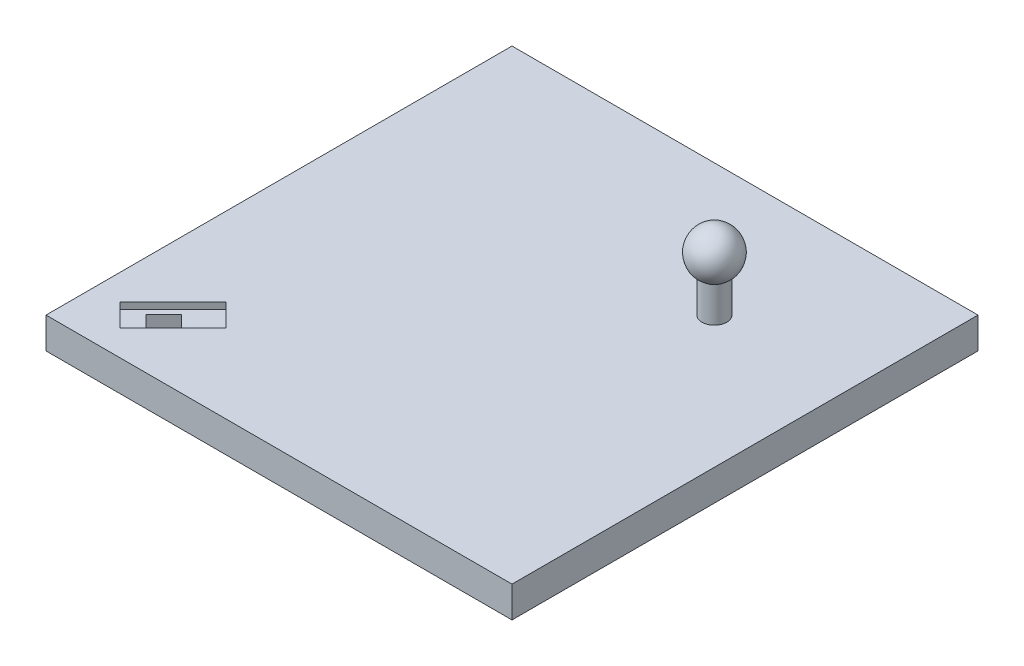
ISO-10303-21;
HEADER;
FILE_DESCRIPTION(('STEP AP214'),'2;1');
FILE_NAME('part.step','',(''),(''),'','','');
FILE_SCHEMA(('AUTOMOTIVE_DESIGN { 1 0 10303 214 1 1 1 1 }'));
ENDSEC;
DATA;
#1=APPLICATION_CONTEXT('core data for automotive mechanical design processes');
#2=APPLICATION_PROTOCOL_DEFINITION('international standard','automotive_design',2000,#1);
#3=PRODUCT_CONTEXT('',#1,'mechanical');
#4=PRODUCT('Part','Part','',(#3));
#5=PRODUCT_RELATED_PRODUCT_CATEGORY('part','',(#4));
#6=PRODUCT_DEFINITION_FORMATION('','',#4);
#7=PRODUCT_DEFINITION_CONTEXT('part definition',#1,'design');
#8=PRODUCT_DEFINITION('design','',#6,#7);
#9=PRODUCT_DEFINITION_SHAPE('','',#8);
#10=(LENGTH_UNIT() NAMED_UNIT(*) SI_UNIT(.MILLI.,.METRE.));
#11=(NAMED_UNIT(*) PLANE_ANGLE_UNIT() SI_UNIT($,.RADIAN.));
#12=(NAMED_UNIT(*) SI_UNIT($,.STERADIAN.) SOLID_ANGLE_UNIT());
#13=UNCERTAINTY_MEASURE_WITH_UNIT(LENGTH_MEASURE(1.E-05),#10,'distance_accuracy_value','');
#14=(GEOMETRIC_REPRESENTATION_CONTEXT(3) GLOBAL_UNCERTAINTY_ASSIGNED_CONTEXT((#13)) GLOBAL_UNIT_ASSIGNED_CONTEXT((#10,
#11,#12)) REPRESENTATION_CONTEXT('',''));
#15=CARTESIAN_POINT('',(0.,0.,0.));
#16=DIRECTION('',(0.,0.,1.));
#17=DIRECTION('',(1.,0.,0.));
#18=AXIS2_PLACEMENT_3D('',#15,#16,#17);
#19=CARTESIAN_POINT('',(0.,10.,0.));
#20=DIRECTION('',(0.,-1.,0.));
#21=DIRECTION('',(0.,0.,-1.));
#22=AXIS2_PLACEMENT_3D('',#19,#20,#21);
#23=PLANE('',#22);
#24=CARTESIAN_POINT('',(32.5735931288071,10.,-32.5735931288072));
#25=DIRECTION('',(0.,-1.,0.));
#26=DIRECTION('',(0.,0.,-1.));
#27=AXIS2_PLACEMENT_3D('',#24,#25,#26);
#28=CIRCLE('',#27,4.00000000000001);
#29=CARTESIAN_POINT('',(32.5735931288071,10.,-36.5735931288072));
#30=VERTEX_POINT('',#29);
#31=EDGE_CURVE('E11',#30,#30,#28,.F.);
#32=ORIENTED_EDGE('',*,*,#31,.F.);
#33=EDGE_LOOP('',(#32));
#34=FACE_BOUND('',#33,.T.);
#35=DIRECTION('',(0.,0.,-1.));
#36=VECTOR('',#35,1.);
#37=CARTESIAN_POINT('',(75.,10.,75.));
#38=LINE('',#37,#36);
#39=CARTESIAN_POINT('',(75.,10.,75.));
#40=VERTEX_POINT('',#39);
#41=CARTESIAN_POINT('',(75.,10.,-75.));
#42=VERTEX_POINT('',#41);
#43=EDGE_CURVE('E261',#40,#42,#38,.T.);
#44=ORIENTED_EDGE('',*,*,#43,.T.);
#45=DIRECTION('',(-1.,0.,0.));
#46=VECTOR('',#45,1.);
#47=CARTESIAN_POINT('',(-75.,10.,-75.));
#48=LINE('',#47,#46);
#49=CARTESIAN_POINT('',(-75.,10.,-75.));
#50=VERTEX_POINT('',#49);
#51=EDGE_CURVE('E83',#42,#50,#48,.T.);
#52=ORIENTED_EDGE('',*,*,#51,.T.);
#53=DIRECTION('',(0.,0.,1.));
#54=VECTOR('',#53,1.);
#55=CARTESIAN_POINT('',(-75.,10.,75.));
#56=LINE('',#55,#54);
#57=CARTESIAN_POINT('',(-75.,10.,75.));
#58=VERTEX_POINT('',#57);
#59=EDGE_CURVE('E264',#50,#58,#56,.T.);
#60=ORIENTED_EDGE('',*,*,#59,.T.);
#61=DIRECTION('',(1.,0.,0.));
#62=VECTOR('',#61,1.);
#63=CARTESIAN_POINT('',(-75.,10.,75.));
#64=LINE('',#63,#62);
#65=EDGE_CURVE('E51',#58,#40,#64,.T.);
#66=ORIENTED_EDGE('',*,*,#65,.T.);
#67=EDGE_LOOP('',(#44,#52,#60,#66));
#68=FACE_BOUND('',#67,.T.);
#69=DIRECTION('',(-0.707106781186546,0.,0.707106781186549));
#70=VECTOR('',#69,1.);
#71=CARTESIAN_POINT('',(-59.5227469741589,10.,66.7352361422619));
#72=LINE('',#71,#70);
#73=CARTESIAN_POINT('',(-42.4107628694445,10.,49.6232520375474));
#74=VERTEX_POINT('',#73);
#75=CARTESIAN_POINT('',(-59.5227469741589,10.,66.7352361422619));
#76=VERTEX_POINT('',#75);
#77=EDGE_CURVE('E192',#74,#76,#72,.T.);
#78=ORIENTED_EDGE('',*,*,#77,.T.);
#79=DIRECTION('',(-0.707106781186549,0.,-0.707106781186546));
#80=VECTOR('',#79,1.);
#81=CARTESIAN_POINT('',(-60.936960536532,10.,65.3210225798888));
#82=LINE('',#81,#80);
#83=CARTESIAN_POINT('',(-66.7352361422617,10.,59.5227469741591));
#84=VERTEX_POINT('',#83);
#85=EDGE_CURVE('E241',#76,#84,#82,.T.);
#86=ORIENTED_EDGE('',*,*,#85,.T.);
#87=DIRECTION('',(-0.707106781186546,0.,0.707106781186549));
#88=VECTOR('',#87,1.);
#89=CARTESIAN_POINT('',(-66.7352361422617,10.,59.5227469741591));
#90=LINE('',#89,#88);
#91=CARTESIAN_POINT('',(-49.6232520375473,10.,42.4107628694447));
#92=VERTEX_POINT('',#91);
#93=EDGE_CURVE('E180',#92,#84,#90,.T.);
#94=ORIENTED_EDGE('',*,*,#93,.F.);
#95=DIRECTION('',(-0.707106781186549,0.,-0.707106781186546));
#96=VECTOR('',#95,1.);
#97=CARTESIAN_POINT('',(-43.8249764318176,10.,48.2090384751744));
#98=LINE('',#97,#96);
#99=EDGE_CURVE('E243',#74,#92,#98,.T.);
#100=ORIENTED_EDGE('',*,*,#99,.F.);
#101=EDGE_LOOP('',(#78,#86,#94,#100));
#102=FACE_BOUND('',#101,.T.);
#103=ADVANCED_FACE('F34',(#34,#68,#102),#23,.F.);
#104=CARTESIAN_POINT('',(-47.1483783033944,1.79405183103738,51.5324403467511));
#105=DIRECTION('',(0.707106781186549,0.,0.707106781186546));
#106=DIRECTION('',(0.707106781186546,0.,-0.707106781186549));
#107=AXIS2_PLACEMENT_3D('',#104,#105,#106);
#108=PLANE('',#107);
#109=DIRECTION('',(-0.707106781186546,0.,0.707106781186549));
#110=VECTOR('',#109,1.);
#111=CARTESIAN_POINT('',(-47.1483783033944,8.,51.5324403467511));
#112=LINE('',#111,#110);
#113=CARTESIAN_POINT('',(-51.0374655999204,8.,55.4215276432772));
#114=VERTEX_POINT('',#113);
#115=CARTESIAN_POINT('',(-56.6943198494127,8.,61.0783818927695));
#116=VERTEX_POINT('',#115);
#117=EDGE_CURVE('E195',#114,#116,#112,.T.);
#118=ORIENTED_EDGE('',*,*,#117,.F.);
#119=DIRECTION('',(0.,1.,0.));
#120=VECTOR('',#119,1.);
#121=CARTESIAN_POINT('',(-51.0374655999204,6.,55.4215276432772));
#122=LINE('',#121,#120);
#123=CARTESIAN_POINT('',(-51.0374655999204,6.,55.4215276432772));
#124=VERTEX_POINT('',#123);
#125=EDGE_CURVE('E229',#124,#114,#122,.T.);
#126=ORIENTED_EDGE('',*,*,#125,.F.);
#127=DIRECTION('',(-0.707106781186547,0.,0.707106781186548));
#128=VECTOR('',#127,1.);
#129=CARTESIAN_POINT('',(-48.2797491532928,6.,52.6638111966496));
#130=LINE('',#129,#128);
#131=CARTESIAN_POINT('',(-48.2797491532928,6.,52.6638111966496));
#132=VERTEX_POINT('',#131);
#133=EDGE_CURVE('E227',#132,#124,#130,.T.);
#134=ORIENTED_EDGE('',*,*,#133,.F.);
#135=CARTESIAN_POINT('',(-47.1483783033944,1.79405183103738,51.5324403467511));
#136=DIRECTION('',(0.707106781186549,0.,0.707106781186546));
#137=DIRECTION('',(0.707106781186546,0.,-0.707106781186549));
#138=AXIS2_PLACEMENT_3D('',#135,#136,#137);
#139=CIRCLE('',#138,4.5);
#140=CARTESIAN_POINT('',(-46.0170074534959,6.,50.4010694968527));
#141=VERTEX_POINT('',#140);
#142=EDGE_CURVE('E225',#141,#132,#139,.T.);
#143=ORIENTED_EDGE('',*,*,#142,.F.);
#144=DIRECTION('',(0.,1.,0.));
#145=VECTOR('',#144,1.);
#146=CARTESIAN_POINT('',(-46.0170074534959,4.,50.4010694968527));
#147=LINE('',#146,#145);
#148=CARTESIAN_POINT('',(-46.0170074534959,4.,50.4010694968527));
#149=VERTEX_POINT('',#148);
#150=EDGE_CURVE('E223',#149,#141,#147,.T.);
#151=ORIENTED_EDGE('',*,*,#150,.F.);
#152=CARTESIAN_POINT('',(-47.1483783033944,8.20594816896262,51.5324403467511));
#153=DIRECTION('',(0.707106781186549,0.,0.707106781186546));
#154=DIRECTION('',(-0.707106781186546,0.,0.707106781186549));
#155=AXIS2_PLACEMENT_3D('',#152,#153,#154);
#156=CIRCLE('',#155,4.5);
#157=CARTESIAN_POINT('',(-48.2797491532928,4.,52.6638111966496));
#158=VERTEX_POINT('',#157);
#159=EDGE_CURVE('E221',#158,#149,#156,.T.);
#160=ORIENTED_EDGE('',*,*,#159,.F.);
#161=DIRECTION('',(0.707106781186546,0.,-0.707106781186549));
#162=VECTOR('',#161,1.);
#163=CARTESIAN_POINT('',(-48.2797491532928,4.,52.6638111966496));
#164=LINE('',#163,#162);
#165=CARTESIAN_POINT('',(-56.6943198494127,4.,61.0783818927695));
#166=VERTEX_POINT('',#165);
#167=EDGE_CURVE('E218',#166,#158,#164,.T.);
#168=ORIENTED_EDGE('',*,*,#167,.F.);
#169=DIRECTION('',(0.,-1.,0.));
#170=VECTOR('',#169,1.);
#171=CARTESIAN_POINT('',(-56.6943198494127,4.,61.0783818927695));
#172=LINE('',#171,#170);
#173=EDGE_CURVE('E232',#116,#166,#172,.T.);
#174=ORIENTED_EDGE('',*,*,#173,.F.);
#175=EDGE_LOOP('',(#118,#126,#134,#143,#151,#160,#168,#174));
#176=FACE_BOUND('',#175,.T.);
#177=ADVANCED_FACE('F320',(#176),#108,.F.);
#178=CARTESIAN_POINT('',(-51.532440346751,1.79405183103738,47.1483783033946));
#179=DIRECTION('',(0.707106781186549,0.,0.707106781186546));
#180=DIRECTION('',(0.707106781186546,0.,-0.707106781186549));
#181=AXIS2_PLACEMENT_3D('',#178,#179,#180);
#182=PLANE('',#181);
#183=DIRECTION('',(0.,1.,0.));
#184=VECTOR('',#183,1.);
#185=CARTESIAN_POINT('',(-55.421527643277,6.,51.0374655999206));
#186=LINE('',#185,#184);
#187=CARTESIAN_POINT('',(-55.421527643277,6.,51.0374655999206));
#188=VERTEX_POINT('',#187);
#189=CARTESIAN_POINT('',(-55.421527643277,8.,51.0374655999206));
#190=VERTEX_POINT('',#189);
#191=EDGE_CURVE('E212',#188,#190,#186,.T.);
#192=ORIENTED_EDGE('',*,*,#191,.T.);
#193=DIRECTION('',(-0.707106781186546,0.,0.707106781186549));
#194=VECTOR('',#193,1.);
#195=CARTESIAN_POINT('',(-51.532440346751,8.,47.1483783033946));
#196=LINE('',#195,#194);
#197=CARTESIAN_POINT('',(-61.0783818927693,8.,56.6943198494129));
#198=VERTEX_POINT('',#197);
#199=EDGE_CURVE('E43',#190,#198,#196,.T.);
#200=ORIENTED_EDGE('',*,*,#199,.T.);
#201=DIRECTION('',(0.,-1.,0.));
#202=VECTOR('',#201,1.);
#203=CARTESIAN_POINT('',(-61.0783818927693,4.,56.6943198494129));
#204=LINE('',#203,#202);
#205=CARTESIAN_POINT('',(-61.0783818927693,4.,56.6943198494129));
#206=VERTEX_POINT('',#205);
#207=EDGE_CURVE('E215',#198,#206,#204,.T.);
#208=ORIENTED_EDGE('',*,*,#207,.T.);
#209=DIRECTION('',(0.707106781186546,0.,-0.707106781186549));
#210=VECTOR('',#209,1.);
#211=CARTESIAN_POINT('',(-52.6638111966494,4.,48.279749153293));
#212=LINE('',#211,#210);
#213=CARTESIAN_POINT('',(-52.6638111966494,4.,48.279749153293));
#214=VERTEX_POINT('',#213);
#215=EDGE_CURVE('E197',#206,#214,#212,.T.);
#216=ORIENTED_EDGE('',*,*,#215,.T.);
#217=CARTESIAN_POINT('',(-51.532440346751,8.20594816896262,47.1483783033946));
#218=DIRECTION('',(0.707106781186549,0.,0.707106781186546));
#219=DIRECTION('',(-0.707106781186546,0.,0.707106781186549));
#220=AXIS2_PLACEMENT_3D('',#217,#218,#219);
#221=CIRCLE('',#220,4.5);
#222=CARTESIAN_POINT('',(-50.4010694968525,4.,46.0170074534961));
#223=VERTEX_POINT('',#222);
#224=EDGE_CURVE('E200',#214,#223,#221,.T.);
#225=ORIENTED_EDGE('',*,*,#224,.T.);
#226=DIRECTION('',(0.,1.,0.));
#227=VECTOR('',#226,1.);
#228=CARTESIAN_POINT('',(-50.4010694968525,4.,46.0170074534961));
#229=LINE('',#228,#227);
#230=CARTESIAN_POINT('',(-50.4010694968525,6.,46.0170074534961));
#231=VERTEX_POINT('',#230);
#232=EDGE_CURVE('E203',#223,#231,#229,.T.);
#233=ORIENTED_EDGE('',*,*,#232,.T.);
#234=CARTESIAN_POINT('',(-51.532440346751,1.79405183103738,47.1483783033946));
#235=DIRECTION('',(0.707106781186549,0.,0.707106781186546));
#236=DIRECTION('',(0.707106781186546,0.,-0.707106781186549));
#237=AXIS2_PLACEMENT_3D('',#234,#235,#236);
#238=CIRCLE('',#237,4.5);
#239=CARTESIAN_POINT('',(-52.6638111966494,6.,48.279749153293));
#240=VERTEX_POINT('',#239);
#241=EDGE_CURVE('E206',#231,#240,#238,.T.);
#242=ORIENTED_EDGE('',*,*,#241,.T.);
#243=DIRECTION('',(-0.707106781186547,0.,0.707106781186548));
#244=VECTOR('',#243,1.);
#245=CARTESIAN_POINT('',(-52.6638111966494,6.,48.279749153293));
#246=LINE('',#245,#244);
#247=EDGE_CURVE('E209',#240,#188,#246,.T.);
#248=ORIENTED_EDGE('',*,*,#247,.T.);
#249=EDGE_LOOP('',(#192,#200,#208,#216,#225,#233,#242,#248));
#250=FACE_BOUND('',#249,.T.);
#251=ADVANCED_FACE('F281',(#250),#182,.T.);
#252=CARTESIAN_POINT('',(75.,10.,75.));
#253=DIRECTION('',(-1.,0.,0.));
#254=DIRECTION('',(0.,0.,1.));
#255=AXIS2_PLACEMENT_3D('',#252,#253,#254);
#256=PLANE('',#255);
#257=DIRECTION('',(0.,0.,-1.));
#258=VECTOR('',#257,1.);
#259=CARTESIAN_POINT('',(75.,0.,75.));
#260=LINE('',#259,#258);
#261=CARTESIAN_POINT('',(75.,0.,75.));
#262=VERTEX_POINT('',#261);
#263=CARTESIAN_POINT('',(75.,0.,-75.));
#264=VERTEX_POINT('',#263);
#265=EDGE_CURVE('E260',#262,#264,#260,.T.);
#266=ORIENTED_EDGE('',*,*,#265,.T.);
#267=DIRECTION('',(0.,-1.,0.));
#268=VECTOR('',#267,1.);
#269=CARTESIAN_POINT('',(75.,10.,-75.));
#270=LINE('',#269,#268);
#271=EDGE_CURVE('E279',#42,#264,#270,.T.);
#272=ORIENTED_EDGE('',*,*,#271,.F.);
#273=ORIENTED_EDGE('',*,*,#43,.F.);
#274=DIRECTION('',(0.,-1.,0.));
#275=VECTOR('',#274,1.);
#276=CARTESIAN_POINT('',(75.,10.,75.));
#277=LINE('',#276,#275);
#278=EDGE_CURVE('E267',#40,#262,#277,.T.);
#279=ORIENTED_EDGE('',*,*,#278,.T.);
#280=EDGE_LOOP('',(#266,#272,#273,#279));
#281=FACE_BOUND('',#280,.T.);
#282=ADVANCED_FACE('F36',(#281),#256,.F.);
#283=CARTESIAN_POINT('',(-75.,10.,-75.));
#284=DIRECTION('',(0.,0.,1.));
#285=DIRECTION('',(1.,0.,0.));
#286=AXIS2_PLACEMENT_3D('',#283,#284,#285);
#287=PLANE('',#286);
#288=DIRECTION('',(-1.,0.,0.));
#289=VECTOR('',#288,1.);
#290=CARTESIAN_POINT('',(-75.,0.,-75.));
#291=LINE('',#290,#289);
#292=CARTESIAN_POINT('',(-75.,0.,-75.));
#293=VERTEX_POINT('',#292);
#294=EDGE_CURVE('E270',#264,#293,#291,.T.);
#295=ORIENTED_EDGE('',*,*,#294,.T.);
#296=DIRECTION('',(0.,-1.,0.));
#297=VECTOR('',#296,1.);
#298=CARTESIAN_POINT('',(-75.,10.,-75.));
#299=LINE('',#298,#297);
#300=EDGE_CURVE('E277',#50,#293,#299,.T.);
#301=ORIENTED_EDGE('',*,*,#300,.F.);
#302=ORIENTED_EDGE('',*,*,#51,.F.);
#303=ORIENTED_EDGE('',*,*,#271,.T.);
#304=EDGE_LOOP('',(#295,#301,#302,#303));
#305=FACE_BOUND('',#304,.T.);
#306=ADVANCED_FACE('F367',(#305),#287,.F.);
#307=CARTESIAN_POINT('',(-75.,10.,75.));
#308=DIRECTION('',(1.,0.,0.));
#309=DIRECTION('',(0.,0.,-1.));
#310=AXIS2_PLACEMENT_3D('',#307,#308,#309);
#311=PLANE('',#310);
#312=DIRECTION('',(0.,0.,1.));
#313=VECTOR('',#312,1.);
#314=CARTESIAN_POINT('',(-75.,0.,75.));
#315=LINE('',#314,#313);
#316=CARTESIAN_POINT('',(-75.,0.,75.));
#317=VERTEX_POINT('',#316);
#318=EDGE_CURVE('E69',#293,#317,#315,.T.);
#319=ORIENTED_EDGE('',*,*,#318,.T.);
#320=DIRECTION('',(0.,-1.,0.));
#321=VECTOR('',#320,1.);
#322=CARTESIAN_POINT('',(-75.,10.,75.));
#323=LINE('',#322,#321);
#324=EDGE_CURVE('E275',#58,#317,#323,.T.);
#325=ORIENTED_EDGE('',*,*,#324,.F.);
#326=ORIENTED_EDGE('',*,*,#59,.F.);
#327=ORIENTED_EDGE('',*,*,#300,.T.);
#328=EDGE_LOOP('',(#319,#325,#326,#327));
#329=FACE_BOUND('',#328,.T.);
#330=ADVANCED_FACE('F365',(#329),#311,.F.);
#331=CARTESIAN_POINT('',(-75.,10.,75.));
#332=DIRECTION('',(0.,0.,-1.));
#333=DIRECTION('',(-1.,0.,0.));
#334=AXIS2_PLACEMENT_3D('',#331,#332,#333);
#335=PLANE('',#334);
#336=DIRECTION('',(1.,0.,0.));
#337=VECTOR('',#336,1.);
#338=CARTESIAN_POINT('',(-75.,0.,75.));
#339=LINE('',#338,#337);
#340=EDGE_CURVE('E75',#317,#262,#339,.T.);
#341=ORIENTED_EDGE('',*,*,#340,.T.);
#342=ORIENTED_EDGE('',*,*,#278,.F.);
#343=ORIENTED_EDGE('',*,*,#65,.F.);
#344=ORIENTED_EDGE('',*,*,#324,.T.);
#345=EDGE_LOOP('',(#341,#342,#343,#344));
#346=FACE_BOUND('',#345,.T.);
#347=ADVANCED_FACE('F361',(#346),#335,.F.);
#348=CARTESIAN_POINT('',(0.,0.,0.));
#349=DIRECTION('',(0.,-1.,0.));
#350=DIRECTION('',(0.,0.,-1.));
#351=AXIS2_PLACEMENT_3D('',#348,#349,#350);
#352=PLANE('',#351);
#353=ORIENTED_EDGE('',*,*,#265,.F.);
#354=ORIENTED_EDGE('',*,*,#340,.F.);
#355=ORIENTED_EDGE('',*,*,#318,.F.);
#356=ORIENTED_EDGE('',*,*,#294,.F.);
#357=EDGE_LOOP('',(#353,#354,#355,#356));
#358=FACE_BOUND('',#357,.T.);
#359=ADVANCED_FACE('F357',(#358),#352,.T.);
#360=CARTESIAN_POINT('',(-48.2797491532928,4.,52.6638111966496));
#361=DIRECTION('',(0.,1.,0.));
#362=DIRECTION('',(0.,0.,1.));
#363=AXIS2_PLACEMENT_3D('',#360,#361,#362);
#364=PLANE('',#363);
#365=DIRECTION('',(-0.707106781186549,0.,-0.707106781186546));
#366=VECTOR('',#365,1.);
#367=CARTESIAN_POINT('',(-56.6943198494127,4.,61.0783818927695));
#368=LINE('',#367,#366);
#369=EDGE_CURVE('E234',#166,#206,#368,.T.);
#370=ORIENTED_EDGE('',*,*,#369,.F.);
#371=ORIENTED_EDGE('',*,*,#167,.T.);
#372=DIRECTION('',(-0.707106781186549,0.,-0.707106781186546));
#373=VECTOR('',#372,1.);
#374=CARTESIAN_POINT('',(-48.2797491532928,4.,52.6638111966496));
#375=LINE('',#374,#373);
#376=EDGE_CURVE('E258',#158,#214,#375,.T.);
#377=ORIENTED_EDGE('',*,*,#376,.T.);
#378=ORIENTED_EDGE('',*,*,#215,.F.);
#379=EDGE_LOOP('',(#370,#371,#377,#378));
#380=FACE_BOUND('',#379,.T.);
#381=ADVANCED_FACE('F295',(#380),#364,.T.);
#382=CARTESIAN_POINT('',(-47.1483783033944,8.20594816896262,51.5324403467511));
#383=DIRECTION('',(-0.707106781186549,0.,-0.707106781186546));
#384=DIRECTION('',(-0.707106781186546,0.,0.707106781186549));
#385=AXIS2_PLACEMENT_3D('',#382,#383,#384);
#386=CYLINDRICAL_SURFACE('',#385,4.5);
#387=ORIENTED_EDGE('',*,*,#376,.F.);
#388=ORIENTED_EDGE('',*,*,#159,.T.);
#389=DIRECTION('',(-0.707106781186549,0.,-0.707106781186546));
#390=VECTOR('',#389,1.);
#391=CARTESIAN_POINT('',(-46.0170074534959,4.,50.4010694968527));
#392=LINE('',#391,#390);
#393=EDGE_CURVE('E256',#149,#223,#392,.T.);
#394=ORIENTED_EDGE('',*,*,#393,.T.);
#395=ORIENTED_EDGE('',*,*,#224,.F.);
#396=EDGE_LOOP('',(#387,#388,#394,#395));
#397=FACE_BOUND('',#396,.T.);
#398=ADVANCED_FACE('F300',(#397),#386,.F.);
#399=CARTESIAN_POINT('',(-46.0170074534959,4.,50.4010694968527));
#400=DIRECTION('',(-0.707106781186546,0.,0.707106781186549));
#401=DIRECTION('',(0.707106781186549,0.,0.707106781186546));
#402=AXIS2_PLACEMENT_3D('',#399,#400,#401);
#403=PLANE('',#402);
#404=ORIENTED_EDGE('',*,*,#393,.F.);
#405=ORIENTED_EDGE('',*,*,#150,.T.);
#406=DIRECTION('',(-0.707106781186549,0.,-0.707106781186546));
#407=VECTOR('',#406,1.);
#408=CARTESIAN_POINT('',(-46.0170074534959,6.,50.4010694968527));
#409=LINE('',#408,#407);
#410=EDGE_CURVE('E254',#141,#231,#409,.T.);
#411=ORIENTED_EDGE('',*,*,#410,.T.);
#412=ORIENTED_EDGE('',*,*,#232,.F.);
#413=EDGE_LOOP('',(#404,#405,#411,#412));
#414=FACE_BOUND('',#413,.T.);
#415=ADVANCED_FACE('F304',(#414),#403,.T.);
#416=CARTESIAN_POINT('',(-47.1483783033944,1.79405183103738,51.5324403467511));
#417=DIRECTION('',(-0.707106781186549,0.,-0.707106781186546));
#418=DIRECTION('',(-0.707106781186546,0.,0.707106781186549));
#419=AXIS2_PLACEMENT_3D('',#416,#417,#418);
#420=CYLINDRICAL_SURFACE('',#419,4.5);
#421=ORIENTED_EDGE('',*,*,#410,.F.);
#422=ORIENTED_EDGE('',*,*,#142,.T.);
#423=DIRECTION('',(-0.707106781186549,0.,-0.707106781186546));
#424=VECTOR('',#423,1.);
#425=CARTESIAN_POINT('',(-48.2797491532928,6.,52.6638111966496));
#426=LINE('',#425,#424);
#427=EDGE_CURVE('E252',#132,#240,#426,.T.);
#428=ORIENTED_EDGE('',*,*,#427,.T.);
#429=ORIENTED_EDGE('',*,*,#241,.F.);
#430=EDGE_LOOP('',(#421,#422,#428,#429));
#431=FACE_BOUND('',#430,.T.);
#432=ADVANCED_FACE('F309',(#431),#420,.F.);
#433=CARTESIAN_POINT('',(-48.2797491532928,6.,52.6638111966496));
#434=DIRECTION('',(0.,-1.,0.));
#435=DIRECTION('',(0.,0.,-1.));
#436=AXIS2_PLACEMENT_3D('',#433,#434,#435);
#437=PLANE('',#436);
#438=ORIENTED_EDGE('',*,*,#427,.F.);
#439=ORIENTED_EDGE('',*,*,#133,.T.);
#440=DIRECTION('',(-0.707106781186549,0.,-0.707106781186546));
#441=VECTOR('',#440,1.);
#442=CARTESIAN_POINT('',(-51.0374655999204,6.,55.4215276432772));
#443=LINE('',#442,#441);
#444=EDGE_CURVE('E250',#124,#188,#443,.T.);
#445=ORIENTED_EDGE('',*,*,#444,.T.);
#446=ORIENTED_EDGE('',*,*,#247,.F.);
#447=EDGE_LOOP('',(#438,#439,#445,#446));
#448=FACE_BOUND('',#447,.T.);
#449=ADVANCED_FACE('F313',(#448),#437,.T.);
#450=CARTESIAN_POINT('',(-51.0374655999204,6.,55.4215276432772));
#451=DIRECTION('',(-0.707106781186546,0.,0.707106781186549));
#452=DIRECTION('',(0.707106781186549,0.,0.707106781186546));
#453=AXIS2_PLACEMENT_3D('',#450,#451,#452);
#454=PLANE('',#453);
#455=ORIENTED_EDGE('',*,*,#444,.F.);
#456=ORIENTED_EDGE('',*,*,#125,.T.);
#457=DIRECTION('',(-0.707106781186549,0.,-0.707106781186546));
#458=VECTOR('',#457,1.);
#459=CARTESIAN_POINT('',(-51.0374655999204,8.,55.4215276432772));
#460=LINE('',#459,#458);
#461=EDGE_CURVE('E247',#114,#190,#460,.T.);
#462=ORIENTED_EDGE('',*,*,#461,.T.);
#463=ORIENTED_EDGE('',*,*,#191,.F.);
#464=EDGE_LOOP('',(#455,#456,#462,#463));
#465=FACE_BOUND('',#464,.T.);
#466=ADVANCED_FACE('F318',(#465),#454,.T.);
#467=CARTESIAN_POINT('',(-51.0374655999204,8.,55.4215276432772));
#468=DIRECTION('',(0.,1.,0.));
#469=DIRECTION('',(0.,0.,1.));
#470=AXIS2_PLACEMENT_3D('',#467,#468,#469);
#471=PLANE('',#470);
#472=DIRECTION('',(0.707106781186546,0.,-0.707106781186549));
#473=VECTOR('',#472,1.);
#474=CARTESIAN_POINT('',(-59.5227469741589,8.,66.7352361422619));
#475=LINE('',#474,#473);
#476=CARTESIAN_POINT('',(-59.5227469741589,8.,66.7352361422619));
#477=VERTEX_POINT('',#476);
#478=CARTESIAN_POINT('',(-42.4107628694445,8.,49.6232520375474));
#479=VERTEX_POINT('',#478);
#480=EDGE_CURVE('E186',#477,#479,#475,.T.);
#481=ORIENTED_EDGE('',*,*,#480,.T.);
#482=DIRECTION('',(-0.707106781186549,0.,-0.707106781186546));
#483=VECTOR('',#482,1.);
#484=CARTESIAN_POINT('',(-43.8249764318176,8.,48.2090384751744));
#485=LINE('',#484,#483);
#486=CARTESIAN_POINT('',(-49.6232520375473,8.,42.4107628694447));
#487=VERTEX_POINT('',#486);
#488=EDGE_CURVE('E245',#479,#487,#485,.T.);
#489=ORIENTED_EDGE('',*,*,#488,.T.);
#490=DIRECTION('',(0.707106781186546,0.,-0.707106781186549));
#491=VECTOR('',#490,1.);
#492=CARTESIAN_POINT('',(-66.7352361422617,8.,59.5227469741591));
#493=LINE('',#492,#491);
#494=CARTESIAN_POINT('',(-66.7352361422617,8.,59.5227469741591));
#495=VERTEX_POINT('',#494);
#496=EDGE_CURVE('E172',#495,#487,#493,.T.);
#497=ORIENTED_EDGE('',*,*,#496,.F.);
#498=DIRECTION('',(-0.707106781186549,0.,-0.707106781186546));
#499=VECTOR('',#498,1.);
#500=CARTESIAN_POINT('',(-60.936960536532,8.,65.3210225798888));
#501=LINE('',#500,#499);
#502=EDGE_CURVE('E239',#477,#495,#501,.T.);
#503=ORIENTED_EDGE('',*,*,#502,.F.);
#504=EDGE_LOOP('',(#481,#489,#497,#503));
#505=FACE_BOUND('',#504,.T.);
#506=ORIENTED_EDGE('',*,*,#461,.F.);
#507=ORIENTED_EDGE('',*,*,#117,.T.);
#508=DIRECTION('',(-0.707106781186549,0.,-0.707106781186546));
#509=VECTOR('',#508,1.);
#510=CARTESIAN_POINT('',(-56.6943198494127,8.,61.0783818927695));
#511=LINE('',#510,#509);
#512=EDGE_CURVE('E236',#116,#198,#511,.T.);
#513=ORIENTED_EDGE('',*,*,#512,.T.);
#514=ORIENTED_EDGE('',*,*,#199,.F.);
#515=EDGE_LOOP('',(#506,#507,#513,#514));
#516=FACE_BOUND('',#515,.T.);
#517=ADVANCED_FACE('F287',(#505,#516),#471,.T.);
#518=CARTESIAN_POINT('',(-43.8249764318176,8.,48.2090384751744));
#519=DIRECTION('',(-0.707106781186546,0.,0.707106781186549));
#520=DIRECTION('',(0.707106781186549,0.,0.707106781186546));
#521=AXIS2_PLACEMENT_3D('',#518,#519,#520);
#522=PLANE('',#521);
#523=ORIENTED_EDGE('',*,*,#488,.F.);
#524=DIRECTION('',(0.,1.,0.));
#525=VECTOR('',#524,1.);
#526=CARTESIAN_POINT('',(-42.4107628694445,10.,49.6232520375474));
#527=LINE('',#526,#525);
#528=EDGE_CURVE('E189',#479,#74,#527,.T.);
#529=ORIENTED_EDGE('',*,*,#528,.T.);
#530=ORIENTED_EDGE('',*,*,#99,.T.);
#531=DIRECTION('',(0.,1.,0.));
#532=VECTOR('',#531,1.);
#533=CARTESIAN_POINT('',(-49.6232520375473,10.,42.4107628694447));
#534=LINE('',#533,#532);
#535=EDGE_CURVE('E177',#487,#92,#534,.T.);
#536=ORIENTED_EDGE('',*,*,#535,.F.);
#537=EDGE_LOOP('',(#523,#529,#530,#536));
#538=FACE_BOUND('',#537,.T.);
#539=ADVANCED_FACE('F338',(#538),#522,.T.);
#540=CARTESIAN_POINT('',(-60.936960536532,8.,65.3210225798888));
#541=DIRECTION('',(0.707106781186546,0.,-0.707106781186549));
#542=DIRECTION('',(-0.707106781186549,0.,-0.707106781186546));
#543=AXIS2_PLACEMENT_3D('',#540,#541,#542);
#544=PLANE('',#543);
#545=ORIENTED_EDGE('',*,*,#85,.F.);
#546=DIRECTION('',(0.,-1.,0.));
#547=VECTOR('',#546,1.);
#548=CARTESIAN_POINT('',(-59.5227469741589,10.,66.7352361422619));
#549=LINE('',#548,#547);
#550=EDGE_CURVE('E183',#76,#477,#549,.T.);
#551=ORIENTED_EDGE('',*,*,#550,.T.);
#552=ORIENTED_EDGE('',*,*,#502,.T.);
#553=DIRECTION('',(0.,-1.,0.));
#554=VECTOR('',#553,1.);
#555=CARTESIAN_POINT('',(-66.7352361422617,10.,59.5227469741591));
#556=LINE('',#555,#554);
#557=EDGE_CURVE('E169',#84,#495,#556,.T.);
#558=ORIENTED_EDGE('',*,*,#557,.F.);
#559=EDGE_LOOP('',(#545,#551,#552,#558));
#560=FACE_BOUND('',#559,.T.);
#561=ADVANCED_FACE('F335',(#560),#544,.T.);
#562=CARTESIAN_POINT('',(-56.6943198494127,4.,61.0783818927695));
#563=DIRECTION('',(0.707106781186546,0.,-0.707106781186549));
#564=DIRECTION('',(-0.707106781186549,0.,-0.707106781186546));
#565=AXIS2_PLACEMENT_3D('',#562,#563,#564);
#566=PLANE('',#565);
#567=ORIENTED_EDGE('',*,*,#512,.F.);
#568=ORIENTED_EDGE('',*,*,#173,.T.);
#569=ORIENTED_EDGE('',*,*,#369,.T.);
#570=ORIENTED_EDGE('',*,*,#207,.F.);
#571=EDGE_LOOP('',(#567,#568,#569,#570));
#572=FACE_BOUND('',#571,.T.);
#573=ADVANCED_FACE('F290',(#572),#566,.T.);
#574=CARTESIAN_POINT('',(-3.6062445840514,0.,-3.60624458405139));
#575=DIRECTION('',(0.707106781186549,0.,0.707106781186546));
#576=DIRECTION('',(0.707106781186546,0.,-0.707106781186549));
#577=AXIS2_PLACEMENT_3D('',#574,#575,#576);
#578=PLANE('',#577);
#579=ORIENTED_EDGE('',*,*,#557,.T.);
#580=ORIENTED_EDGE('',*,*,#496,.T.);
#581=ORIENTED_EDGE('',*,*,#535,.T.);
#582=ORIENTED_EDGE('',*,*,#93,.T.);
#583=EDGE_LOOP('',(#579,#580,#581,#582));
#584=FACE_BOUND('',#583,.T.);
#585=ADVANCED_FACE('F334',(#584),#578,.T.);
#586=CARTESIAN_POINT('',(3.60624458405139,0.,3.60624458405138));
#587=DIRECTION('',(0.707106781186549,0.,0.707106781186546));
#588=DIRECTION('',(0.707106781186546,0.,-0.707106781186549));
#589=AXIS2_PLACEMENT_3D('',#586,#587,#588);
#590=PLANE('',#589);
#591=ORIENTED_EDGE('',*,*,#550,.F.);
#592=ORIENTED_EDGE('',*,*,#77,.F.);
#593=ORIENTED_EDGE('',*,*,#528,.F.);
#594=ORIENTED_EDGE('',*,*,#480,.F.);
#595=EDGE_LOOP('',(#591,#592,#593,#594));
#596=FACE_BOUND('',#595,.T.);
#597=ADVANCED_FACE('F163',(#596),#590,.F.);
#598=CARTESIAN_POINT('',(32.5735931288071,27.5036765685125,-32.80840158379));
#599=DIRECTION('',(-1.,0.,0.));
#600=DIRECTION('',(0.,0.,1.));
#601=AXIS2_PLACEMENT_3D('',#598,#599,#600);
#602=CIRCLE('',#601,7.50000000000001);
#603=TRIMMED_CURVE('',#602,(PARAMETER_VALUE(-1.53948341600498)),
(PARAMETER_VALUE(1.53948341600498)),.T.,.PARAMETER.);
#604=CARTESIAN_POINT('',(32.5735931288071,27.5036765685125,-32.5735931288072));
#605=DIRECTION('',(0.,1.,0.));
#606=AXIS1_PLACEMENT('',#604,#605);
#607=SURFACE_OF_REVOLUTION('',#603,#606);
#608=CARTESIAN_POINT('',(32.5735931288071,35.,-32.5735931288072));
#609=VERTEX_POINT('',#608);
#610=VERTEX_LOOP('',#609);
#611=FACE_BOUND('',#610,.T.);
#612=CARTESIAN_POINT('',(32.5735931288071,21.3136525500126,-32.5735931288072));
#613=DIRECTION('',(0.,1.,0.));
#614=DIRECTION('',(0.,0.,1.));
#615=AXIS2_PLACEMENT_3D('',#612,#613,#614);
#616=CIRCLE('',#615,4.00000000000002);
#617=CARTESIAN_POINT('',(32.5735931288071,21.3136525500126,-28.5735931288072));
#618=VERTEX_POINT('',#617);
#619=EDGE_CURVE('E167',#618,#618,#616,.T.);
#620=ORIENTED_EDGE('',*,*,#619,.T.);
#621=EDGE_LOOP('',(#620));
#622=FACE_BOUND('',#621,.T.);
#623=ADVANCED_FACE('F159',(#611,#622),#607,.T.);
#624=CARTESIAN_POINT('',(32.5735931288071,36.9680712595359,-32.5735931288072));
#625=DIRECTION('',(0.,1.,0.));
#626=DIRECTION('',(0.,0.,1.));
#627=AXIS2_PLACEMENT_3D('',#624,#625,#626);
#628=CYLINDRICAL_SURFACE('',#627,4.00000000000001);
#629=ORIENTED_EDGE('',*,*,#619,.F.);
#630=EDGE_LOOP('',(#629));
#631=FACE_BOUND('',#630,.T.);
#632=ORIENTED_EDGE('',*,*,#31,.T.);
#633=EDGE_LOOP('',(#632));
#634=FACE_BOUND('',#633,.T.);
#635=ADVANCED_FACE('F162',(#631,#634),#628,.T.);
#636=CLOSED_SHELL('',(#103,#177,#251,#282,#306,#330,#347,#359,#381,#398,#415,#432,#449,#466,
#517,#539,#561,#573,#585,#597,#623,#635));
#637=MANIFOLD_SOLID_BREP('B2',#636);
#638=ADVANCED_BREP_SHAPE_REPRESENTATION('',(#18,#637),#14);
#639=SHAPE_DEFINITION_REPRESENTATION(#9,#638);
ENDSEC;
END-ISO-10303-21;
